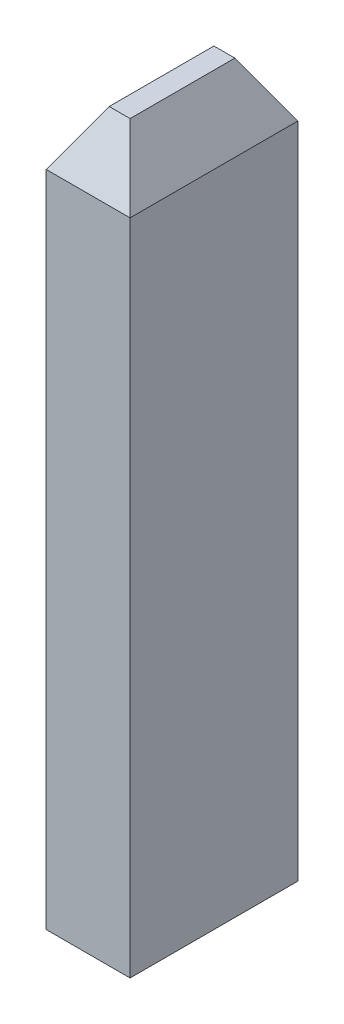
ISO-10303-21;
HEADER;
FILE_DESCRIPTION(('STEP AP214'),'2;1');
FILE_NAME('part.step','',(''),(''),'','','');
FILE_SCHEMA(('AUTOMOTIVE_DESIGN { 1 0 10303 214 1 1 1 1 }'));
ENDSEC;
DATA;
#1=APPLICATION_CONTEXT('core data for automotive mechanical design processes');
#2=APPLICATION_PROTOCOL_DEFINITION('international standard','automotive_design',2000,#1);
#3=PRODUCT_CONTEXT('',#1,'mechanical');
#4=PRODUCT('Part','Part','',(#3));
#5=PRODUCT_RELATED_PRODUCT_CATEGORY('part','',(#4));
#6=PRODUCT_DEFINITION_FORMATION('','',#4);
#7=PRODUCT_DEFINITION_CONTEXT('part definition',#1,'design');
#8=PRODUCT_DEFINITION('design','',#6,#7);
#9=PRODUCT_DEFINITION_SHAPE('','',#8);
#10=(LENGTH_UNIT() NAMED_UNIT(*) SI_UNIT(.MILLI.,.METRE.));
#11=(NAMED_UNIT(*) PLANE_ANGLE_UNIT() SI_UNIT($,.RADIAN.));
#12=(NAMED_UNIT(*) SI_UNIT($,.STERADIAN.) SOLID_ANGLE_UNIT());
#13=UNCERTAINTY_MEASURE_WITH_UNIT(LENGTH_MEASURE(1.E-05),#10,'distance_accuracy_value','');
#14=(GEOMETRIC_REPRESENTATION_CONTEXT(3) GLOBAL_UNCERTAINTY_ASSIGNED_CONTEXT((#13)) GLOBAL_UNIT_ASSIGNED_CONTEXT((#10,
#11,#12)) REPRESENTATION_CONTEXT('',''));
#15=CARTESIAN_POINT('',(0.,0.,0.));
#16=DIRECTION('',(0.,0.,1.));
#17=DIRECTION('',(1.,0.,0.));
#18=AXIS2_PLACEMENT_3D('',#15,#16,#17);
#19=CARTESIAN_POINT('',(-0.249444650053487,17.,0.));
#20=DIRECTION('',(-0.86602540378444,0.499999999999997,0.));
#21=DIRECTION('',(-0.499999999999997,-0.86602540378444,0.));
#22=AXIS2_PLACEMENT_3D('',#19,#20,#21);
#23=PLANE('',#22);
#24=DIRECTION('',(0.,0.,1.));
#25=VECTOR('',#24,1.);
#26=CARTESIAN_POINT('',(-0.249444650053487,17.,0.));
#27=LINE('',#26,#25);
#28=CARTESIAN_POINT('',(-0.249444650053487,17.,-1.24944465005349));
#29=VERTEX_POINT('',#28);
#30=CARTESIAN_POINT('',(-0.249444650053487,17.,1.24944465005349));
#31=VERTEX_POINT('',#30);
#32=EDGE_CURVE('E72',#29,#31,#27,.T.);
#33=ORIENTED_EDGE('',*,*,#32,.F.);
#34=DIRECTION('',(0.447213595499956,0.774596669241485,0.447213595499957));
#35=VECTOR('',#34,1.);
#36=CARTESIAN_POINT('',(-1.,15.7,-2.));
#37=LINE('',#36,#35);
#38=CARTESIAN_POINT('',(-1.,15.7,-2.));
#39=VERTEX_POINT('',#38);
#40=EDGE_CURVE('E66',#39,#29,#37,.T.);
#41=ORIENTED_EDGE('',*,*,#40,.F.);
#42=DIRECTION('',(0.,0.,-1.));
#43=VECTOR('',#42,1.);
#44=CARTESIAN_POINT('',(-1.,15.7,-2.));
#45=LINE('',#44,#43);
#46=CARTESIAN_POINT('',(-1.,15.7,2.));
#47=VERTEX_POINT('',#46);
#48=EDGE_CURVE('E84',#39,#47,#45,.F.);
#49=ORIENTED_EDGE('',*,*,#48,.T.);
#50=DIRECTION('',(-0.447213595499955,-0.774596669241486,0.447213595499957));
#51=VECTOR('',#50,1.);
#52=CARTESIAN_POINT('',(-0.249444650053488,17.,1.24944465005349));
#53=LINE('',#52,#51);
#54=EDGE_CURVE('E20',#31,#47,#53,.T.);
#55=ORIENTED_EDGE('',*,*,#54,.F.);
#56=EDGE_LOOP('',(#33,#41,#49,#55));
#57=FACE_BOUND('',#56,.T.);
#58=ADVANCED_FACE('F17',(#57),#23,.T.);
#59=CARTESIAN_POINT('',(0.,17.,1.24944465005349));
#60=DIRECTION('',(0.,0.499999999999998,0.86602540378444));
#61=DIRECTION('',(0.,-0.86602540378444,0.499999999999998));
#62=AXIS2_PLACEMENT_3D('',#59,#60,#61);
#63=PLANE('',#62);
#64=DIRECTION('',(-0.447213595499957,0.774596669241485,-0.447213595499956));
#65=VECTOR('',#64,1.);
#66=CARTESIAN_POINT('',(1.,15.7,2.));
#67=LINE('',#66,#65);
#68=CARTESIAN_POINT('',(1.,15.7,2.));
#69=VERTEX_POINT('',#68);
#70=CARTESIAN_POINT('',(0.249444650053489,17.,1.24944465005349));
#71=VERTEX_POINT('',#70);
#72=EDGE_CURVE('E81',#69,#71,#67,.T.);
#73=ORIENTED_EDGE('',*,*,#72,.T.);
#74=DIRECTION('',(1.,0.,0.));
#75=VECTOR('',#74,1.);
#76=CARTESIAN_POINT('',(0.,17.,1.24944465005349));
#77=LINE('',#76,#75);
#78=EDGE_CURVE('E77',#31,#71,#77,.T.);
#79=ORIENTED_EDGE('',*,*,#78,.F.);
#80=ORIENTED_EDGE('',*,*,#54,.T.);
#81=DIRECTION('',(-1.,0.,0.));
#82=VECTOR('',#81,1.);
#83=CARTESIAN_POINT('',(-1.,15.7,2.));
#84=LINE('',#83,#82);
#85=EDGE_CURVE('E102',#47,#69,#84,.F.);
#86=ORIENTED_EDGE('',*,*,#85,.T.);
#87=EDGE_LOOP('',(#73,#79,#80,#86));
#88=FACE_BOUND('',#87,.T.);
#89=ADVANCED_FACE('F88',(#88),#63,.T.);
#90=CARTESIAN_POINT('',(0.,17.,0.));
#91=DIRECTION('',(0.,1.,0.));
#92=DIRECTION('',(0.,0.,1.));
#93=AXIS2_PLACEMENT_3D('',#90,#91,#92);
#94=PLANE('',#93);
#95=DIRECTION('',(0.,0.,1.));
#96=VECTOR('',#95,1.);
#97=CARTESIAN_POINT('',(0.249444650053489,17.,0.));
#98=LINE('',#97,#96);
#99=CARTESIAN_POINT('',(0.249444650053489,17.,-1.24944465005349));
#100=VERTEX_POINT('',#99);
#101=EDGE_CURVE('E104',#100,#71,#98,.T.);
#102=ORIENTED_EDGE('',*,*,#101,.F.);
#103=DIRECTION('',(1.,0.,0.));
#104=VECTOR('',#103,1.);
#105=CARTESIAN_POINT('',(0.,17.,-1.24944465005349));
#106=LINE('',#105,#104);
#107=EDGE_CURVE('E79',#29,#100,#106,.T.);
#108=ORIENTED_EDGE('',*,*,#107,.F.);
#109=ORIENTED_EDGE('',*,*,#32,.T.);
#110=ORIENTED_EDGE('',*,*,#78,.T.);
#111=EDGE_LOOP('',(#102,#108,#109,#110));
#112=FACE_BOUND('',#111,.T.);
#113=ADVANCED_FACE('F75',(#112),#94,.T.);
#114=CARTESIAN_POINT('',(0.,17.,-1.24944465005349));
#115=DIRECTION('',(0.,0.499999999999998,-0.86602540378444));
#116=DIRECTION('',(0.,0.86602540378444,0.499999999999998));
#117=AXIS2_PLACEMENT_3D('',#114,#115,#116);
#118=PLANE('',#117);
#119=ORIENTED_EDGE('',*,*,#40,.T.);
#120=ORIENTED_EDGE('',*,*,#107,.T.);
#121=DIRECTION('',(-0.447213595499956,0.774596669241485,0.447213595499958));
#122=VECTOR('',#121,1.);
#123=CARTESIAN_POINT('',(1.,15.7,-2.));
#124=LINE('',#123,#122);
#125=CARTESIAN_POINT('',(1.,15.7,-2.));
#126=VERTEX_POINT('',#125);
#127=EDGE_CURVE('E106',#126,#100,#124,.T.);
#128=ORIENTED_EDGE('',*,*,#127,.F.);
#129=DIRECTION('',(1.,0.,0.));
#130=VECTOR('',#129,1.);
#131=CARTESIAN_POINT('',(-1.,15.7,-2.));
#132=LINE('',#131,#130);
#133=EDGE_CURVE('E34',#126,#39,#132,.F.);
#134=ORIENTED_EDGE('',*,*,#133,.T.);
#135=EDGE_LOOP('',(#119,#120,#128,#134));
#136=FACE_BOUND('',#135,.T.);
#137=ADVANCED_FACE('F154',(#136),#118,.T.);
#138=CARTESIAN_POINT('',(-1.,17.,-2.));
#139=DIRECTION('',(1.,0.,0.));
#140=DIRECTION('',(0.,0.,-1.));
#141=AXIS2_PLACEMENT_3D('',#138,#139,#140);
#142=PLANE('',#141);
#143=ORIENTED_EDGE('',*,*,#48,.F.);
#144=DIRECTION('',(0.,1.,0.));
#145=VECTOR('',#144,1.);
#146=CARTESIAN_POINT('',(-1.,17.,-2.));
#147=LINE('',#146,#145);
#148=CARTESIAN_POINT('',(-1.,0.,-2.));
#149=VERTEX_POINT('',#148);
#150=EDGE_CURVE('E113',#39,#149,#147,.F.);
#151=ORIENTED_EDGE('',*,*,#150,.T.);
#152=DIRECTION('',(0.,0.,1.));
#153=VECTOR('',#152,1.);
#154=CARTESIAN_POINT('',(-1.,0.,0.));
#155=LINE('',#154,#153);
#156=CARTESIAN_POINT('',(-1.,0.,2.));
#157=VERTEX_POINT('',#156);
#158=EDGE_CURVE('E94',#149,#157,#155,.T.);
#159=ORIENTED_EDGE('',*,*,#158,.T.);
#160=DIRECTION('',(0.,1.,0.));
#161=VECTOR('',#160,1.);
#162=CARTESIAN_POINT('',(-1.,17.,2.));
#163=LINE('',#162,#161);
#164=EDGE_CURVE('E99',#157,#47,#163,.T.);
#165=ORIENTED_EDGE('',*,*,#164,.T.);
#166=EDGE_LOOP('',(#143,#151,#159,#165));
#167=FACE_BOUND('',#166,.T.);
#168=ADVANCED_FACE('F151',(#167),#142,.F.);
#169=CARTESIAN_POINT('',(0.,0.,0.));
#170=DIRECTION('',(0.,1.,0.));
#171=DIRECTION('',(0.,0.,1.));
#172=AXIS2_PLACEMENT_3D('',#169,#170,#171);
#173=PLANE('',#172);
#174=DIRECTION('',(-1.,0.,0.));
#175=VECTOR('',#174,1.);
#176=CARTESIAN_POINT('',(-1.,0.,2.));
#177=LINE('',#176,#175);
#178=CARTESIAN_POINT('',(1.,0.,2.));
#179=VERTEX_POINT('',#178);
#180=EDGE_CURVE('E96',#179,#157,#177,.T.);
#181=ORIENTED_EDGE('',*,*,#180,.T.);
#182=ORIENTED_EDGE('',*,*,#158,.F.);
#183=DIRECTION('',(1.,0.,0.));
#184=VECTOR('',#183,1.);
#185=CARTESIAN_POINT('',(-1.,0.,-2.));
#186=LINE('',#185,#184);
#187=CARTESIAN_POINT('',(1.,0.,-2.));
#188=VERTEX_POINT('',#187);
#189=EDGE_CURVE('E109',#149,#188,#186,.T.);
#190=ORIENTED_EDGE('',*,*,#189,.T.);
#191=DIRECTION('',(0.,0.,1.));
#192=VECTOR('',#191,1.);
#193=CARTESIAN_POINT('',(1.,0.,-2.));
#194=LINE('',#193,#192);
#195=EDGE_CURVE('E116',#188,#179,#194,.T.);
#196=ORIENTED_EDGE('',*,*,#195,.T.);
#197=EDGE_LOOP('',(#181,#182,#190,#196));
#198=FACE_BOUND('',#197,.T.);
#199=ADVANCED_FACE('F134',(#198),#173,.F.);
#200=CARTESIAN_POINT('',(-1.,17.,2.));
#201=DIRECTION('',(0.,0.,-1.));
#202=DIRECTION('',(-1.,0.,0.));
#203=AXIS2_PLACEMENT_3D('',#200,#201,#202);
#204=PLANE('',#203);
#205=ORIENTED_EDGE('',*,*,#85,.F.);
#206=ORIENTED_EDGE('',*,*,#164,.F.);
#207=ORIENTED_EDGE('',*,*,#180,.F.);
#208=DIRECTION('',(0.,1.,0.));
#209=VECTOR('',#208,1.);
#210=CARTESIAN_POINT('',(1.,17.,2.));
#211=LINE('',#210,#209);
#212=EDGE_CURVE('E119',#179,#69,#211,.T.);
#213=ORIENTED_EDGE('',*,*,#212,.T.);
#214=EDGE_LOOP('',(#205,#206,#207,#213));
#215=FACE_BOUND('',#214,.T.);
#216=ADVANCED_FACE('F131',(#215),#204,.F.);
#217=CARTESIAN_POINT('',(0.249444650053489,17.,0.));
#218=DIRECTION('',(0.86602540378444,0.499999999999998,0.));
#219=DIRECTION('',(-0.499999999999998,0.86602540378444,0.));
#220=AXIS2_PLACEMENT_3D('',#217,#218,#219);
#221=PLANE('',#220);
#222=DIRECTION('',(0.,0.,1.));
#223=VECTOR('',#222,1.);
#224=CARTESIAN_POINT('',(1.,15.7,-2.));
#225=LINE('',#224,#223);
#226=EDGE_CURVE('E26',#69,#126,#225,.F.);
#227=ORIENTED_EDGE('',*,*,#226,.T.);
#228=ORIENTED_EDGE('',*,*,#127,.T.);
#229=ORIENTED_EDGE('',*,*,#101,.T.);
#230=ORIENTED_EDGE('',*,*,#72,.F.);
#231=EDGE_LOOP('',(#227,#228,#229,#230));
#232=FACE_BOUND('',#231,.T.);
#233=ADVANCED_FACE('F125',(#232),#221,.T.);
#234=CARTESIAN_POINT('',(-1.,17.,-2.));
#235=DIRECTION('',(0.,0.,1.));
#236=DIRECTION('',(1.,0.,0.));
#237=AXIS2_PLACEMENT_3D('',#234,#235,#236);
#238=PLANE('',#237);
#239=ORIENTED_EDGE('',*,*,#133,.F.);
#240=DIRECTION('',(0.,1.,0.));
#241=VECTOR('',#240,1.);
#242=CARTESIAN_POINT('',(1.,17.,-2.));
#243=LINE('',#242,#241);
#244=EDGE_CURVE('E11',#126,#188,#243,.F.);
#245=ORIENTED_EDGE('',*,*,#244,.T.);
#246=ORIENTED_EDGE('',*,*,#189,.F.);
#247=ORIENTED_EDGE('',*,*,#150,.F.);
#248=EDGE_LOOP('',(#239,#245,#246,#247));
#249=FACE_BOUND('',#248,.T.);
#250=ADVANCED_FACE('F136',(#249),#238,.F.);
#251=CARTESIAN_POINT('',(1.,17.,-2.));
#252=DIRECTION('',(-1.,0.,0.));
#253=DIRECTION('',(0.,0.,1.));
#254=AXIS2_PLACEMENT_3D('',#251,#252,#253);
#255=PLANE('',#254);
#256=ORIENTED_EDGE('',*,*,#226,.F.);
#257=ORIENTED_EDGE('',*,*,#212,.F.);
#258=ORIENTED_EDGE('',*,*,#195,.F.);
#259=ORIENTED_EDGE('',*,*,#244,.F.);
#260=EDGE_LOOP('',(#256,#257,#258,#259));
#261=FACE_BOUND('',#260,.T.);
#262=ADVANCED_FACE('F129',(#261),#255,.F.);
#263=CLOSED_SHELL('',(#58,#89,#113,#137,#168,#199,#216,#233,#250,#262));
#264=MANIFOLD_SOLID_BREP('B1',#263);
#265=ADVANCED_BREP_SHAPE_REPRESENTATION('',(#18,#264),#14);
#266=SHAPE_DEFINITION_REPRESENTATION(#9,#265);
ENDSEC;
END-ISO-10303-21;
